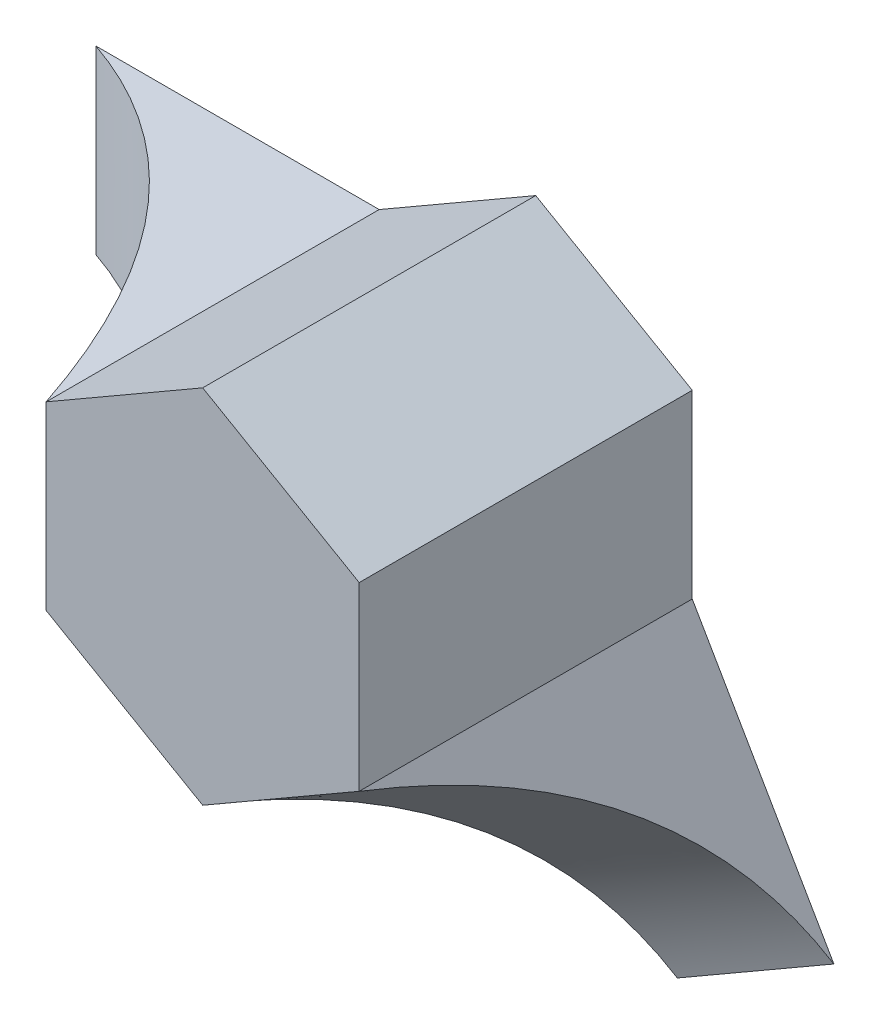
ISO-10303-21;
HEADER;
FILE_DESCRIPTION(('STEP AP214'),'2;1');
FILE_NAME('part.step','',(''),(''),'','','');
FILE_SCHEMA(('AUTOMOTIVE_DESIGN { 1 0 10303 214 1 1 1 1 }'));
ENDSEC;
DATA;
#1=APPLICATION_CONTEXT('core data for automotive mechanical design processes');
#2=APPLICATION_PROTOCOL_DEFINITION('international standard','automotive_design',2000,#1);
#3=PRODUCT_CONTEXT('',#1,'mechanical');
#4=PRODUCT('Part','Part','',(#3));
#5=PRODUCT_RELATED_PRODUCT_CATEGORY('part','',(#4));
#6=PRODUCT_DEFINITION_FORMATION('','',#4);
#7=PRODUCT_DEFINITION_CONTEXT('part definition',#1,'design');
#8=PRODUCT_DEFINITION('design','',#6,#7);
#9=PRODUCT_DEFINITION_SHAPE('','',#8);
#10=(LENGTH_UNIT() NAMED_UNIT(*) SI_UNIT(.MILLI.,.METRE.));
#11=(NAMED_UNIT(*) PLANE_ANGLE_UNIT() SI_UNIT($,.RADIAN.));
#12=(NAMED_UNIT(*) SI_UNIT($,.STERADIAN.) SOLID_ANGLE_UNIT());
#13=UNCERTAINTY_MEASURE_WITH_UNIT(LENGTH_MEASURE(1.E-05),#10,'distance_accuracy_value','');
#14=(GEOMETRIC_REPRESENTATION_CONTEXT(3) GLOBAL_UNCERTAINTY_ASSIGNED_CONTEXT((#13)) GLOBAL_UNIT_ASSIGNED_CONTEXT((#10,
#11,#12)) REPRESENTATION_CONTEXT('',''));
#15=CARTESIAN_POINT('',(0.,0.,0.));
#16=DIRECTION('',(0.,0.,1.));
#17=DIRECTION('',(1.,0.,0.));
#18=AXIS2_PLACEMENT_3D('',#15,#16,#17);
#19=CARTESIAN_POINT('',(44.6490511794399,-25.778141717511,47.5));
#20=DIRECTION('',(-1.,0.,0.));
#21=DIRECTION('',(0.,-1.,0.));
#22=AXIS2_PLACEMENT_3D('',#19,#20,#21);
#23=PLANE('',#22);
#24=DIRECTION('',(0.,1.,0.));
#25=VECTOR('',#24,1.);
#26=CARTESIAN_POINT('',(44.6490511794399,-25.778141717511,-47.5));
#27=LINE('',#26,#25);
#28=CARTESIAN_POINT('',(44.6490511794399,-25.778141717511,-47.5));
#29=VERTEX_POINT('',#28);
#30=CARTESIAN_POINT('',(44.6490511794399,25.778141717511,-47.5));
#31=VERTEX_POINT('',#30);
#32=EDGE_CURVE('E185',#29,#31,#27,.T.);
#33=ORIENTED_EDGE('',*,*,#32,.T.);
#34=DIRECTION('',(0.,0.,-1.));
#35=VECTOR('',#34,1.);
#36=CARTESIAN_POINT('',(44.6490511794399,25.778141717511,47.5));
#37=LINE('',#36,#35);
#38=CARTESIAN_POINT('',(44.6490511794399,25.778141717511,47.5));
#39=VERTEX_POINT('',#38);
#40=EDGE_CURVE('E11',#39,#31,#37,.T.);
#41=ORIENTED_EDGE('',*,*,#40,.F.);
#42=DIRECTION('',(0.,1.,0.));
#43=VECTOR('',#42,1.);
#44=CARTESIAN_POINT('',(44.6490511794399,-25.778141717511,47.5));
#45=LINE('',#44,#43);
#46=CARTESIAN_POINT('',(44.6490511794399,-25.778141717511,47.5));
#47=VERTEX_POINT('',#46);
#48=EDGE_CURVE('E202',#47,#39,#45,.T.);
#49=ORIENTED_EDGE('',*,*,#48,.F.);
#50=DIRECTION('',(0.,0.,-1.));
#51=VECTOR('',#50,1.);
#52=CARTESIAN_POINT('',(44.6490511794399,-25.778141717511,47.5));
#53=LINE('',#52,#51);
#54=EDGE_CURVE('E188',#47,#29,#53,.T.);
#55=ORIENTED_EDGE('',*,*,#54,.T.);
#56=EDGE_LOOP('',(#33,#41,#49,#55));
#57=FACE_BOUND('',#56,.T.);
#58=ADVANCED_FACE('F33',(#57),#23,.F.);
#59=CARTESIAN_POINT('',(44.6490511794399,25.778141717511,47.5));
#60=DIRECTION('',(-0.5,-0.866025403784439,0.));
#61=DIRECTION('',(0.866025403784439,-0.5,0.));
#62=AXIS2_PLACEMENT_3D('',#59,#60,#61);
#63=PLANE('',#62);
#64=DIRECTION('',(-0.866025403784439,0.5,0.));
#65=VECTOR('',#64,1.);
#66=CARTESIAN_POINT('',(44.6490511794399,25.778141717511,-47.5));
#67=LINE('',#66,#65);
#68=CARTESIAN_POINT('',(0.,51.556283435022,-47.5));
#69=VERTEX_POINT('',#68);
#70=EDGE_CURVE('E65',#31,#69,#67,.T.);
#71=ORIENTED_EDGE('',*,*,#70,.T.);
#72=DIRECTION('',(0.,0.,-1.));
#73=VECTOR('',#72,1.);
#74=CARTESIAN_POINT('',(0.,51.556283435022,47.5));
#75=LINE('',#74,#73);
#76=CARTESIAN_POINT('',(0.,51.556283435022,47.5));
#77=VERTEX_POINT('',#76);
#78=EDGE_CURVE('E42',#77,#69,#75,.T.);
#79=ORIENTED_EDGE('',*,*,#78,.F.);
#80=DIRECTION('',(-0.866025403784439,0.5,0.));
#81=VECTOR('',#80,1.);
#82=CARTESIAN_POINT('',(44.6490511794399,25.778141717511,47.5));
#83=LINE('',#82,#81);
#84=EDGE_CURVE('E79',#39,#77,#83,.T.);
#85=ORIENTED_EDGE('',*,*,#84,.F.);
#86=ORIENTED_EDGE('',*,*,#40,.T.);
#87=EDGE_LOOP('',(#71,#79,#85,#86));
#88=FACE_BOUND('',#87,.T.);
#89=ADVANCED_FACE('F173',(#88),#63,.F.);
#90=CARTESIAN_POINT('',(0.,51.556283435022,47.5));
#91=DIRECTION('',(0.5,-0.866025403784439,0.));
#92=DIRECTION('',(0.866025403784439,0.5,0.));
#93=AXIS2_PLACEMENT_3D('',#90,#91,#92);
#94=PLANE('',#93);
#95=DIRECTION('',(-0.866025403784439,-0.5,0.));
#96=VECTOR('',#95,1.);
#97=CARTESIAN_POINT('',(0.,51.556283435022,-47.5));
#98=LINE('',#97,#96);
#99=CARTESIAN_POINT('',(-44.6490511794399,25.778141717511,-47.5));
#100=VERTEX_POINT('',#99);
#101=EDGE_CURVE('E101',#69,#100,#98,.T.);
#102=ORIENTED_EDGE('',*,*,#101,.T.);
#103=DIRECTION('',(0.,0.,-1.));
#104=VECTOR('',#103,1.);
#105=CARTESIAN_POINT('',(-44.6490511794399,25.778141717511,47.5));
#106=LINE('',#105,#104);
#107=CARTESIAN_POINT('',(-44.6490511794399,25.778141717511,47.5));
#108=VERTEX_POINT('',#107);
#109=EDGE_CURVE('E97',#108,#100,#106,.T.);
#110=ORIENTED_EDGE('',*,*,#109,.F.);
#111=DIRECTION('',(-0.866025403784439,-0.5,0.));
#112=VECTOR('',#111,1.);
#113=CARTESIAN_POINT('',(0.,51.556283435022,47.5));
#114=LINE('',#113,#112);
#115=EDGE_CURVE('E87',#77,#108,#114,.T.);
#116=ORIENTED_EDGE('',*,*,#115,.F.);
#117=ORIENTED_EDGE('',*,*,#78,.T.);
#118=EDGE_LOOP('',(#102,#110,#116,#117));
#119=FACE_BOUND('',#118,.T.);
#120=ADVANCED_FACE('F98',(#119),#94,.F.);
#121=CARTESIAN_POINT('',(-44.6490511794399,-25.778141717511,47.5));
#122=DIRECTION('',(0.5,0.866025403784439,0.));
#123=DIRECTION('',(-0.866025403784439,0.5,0.));
#124=AXIS2_PLACEMENT_3D('',#121,#122,#123);
#125=PLANE('',#124);
#126=DIRECTION('',(0.866025403784439,-0.5,0.));
#127=VECTOR('',#126,1.);
#128=CARTESIAN_POINT('',(-44.6490511794399,-25.778141717511,-47.5));
#129=LINE('',#128,#127);
#130=CARTESIAN_POINT('',(-44.6490511794399,-25.778141717511,-47.5));
#131=VERTEX_POINT('',#130);
#132=CARTESIAN_POINT('',(0.,-51.556283435022,-47.5));
#133=VERTEX_POINT('',#132);
#134=EDGE_CURVE('E200',#131,#133,#129,.T.);
#135=ORIENTED_EDGE('',*,*,#134,.T.);
#136=DIRECTION('',(0.,0.,-1.));
#137=VECTOR('',#136,1.);
#138=CARTESIAN_POINT('',(0.,-51.556283435022,47.5));
#139=LINE('',#138,#137);
#140=CARTESIAN_POINT('',(0.,-51.556283435022,47.5));
#141=VERTEX_POINT('',#140);
#142=EDGE_CURVE('E203',#141,#133,#139,.T.);
#143=ORIENTED_EDGE('',*,*,#142,.F.);
#144=DIRECTION('',(0.866025403784439,-0.5,0.));
#145=VECTOR('',#144,1.);
#146=CARTESIAN_POINT('',(-44.6490511794399,-25.778141717511,47.5));
#147=LINE('',#146,#145);
#148=CARTESIAN_POINT('',(-44.6490511794399,-25.778141717511,47.5));
#149=VERTEX_POINT('',#148);
#150=EDGE_CURVE('E117',#149,#141,#147,.T.);
#151=ORIENTED_EDGE('',*,*,#150,.F.);
#152=DIRECTION('',(0.,0.,-1.));
#153=VECTOR('',#152,1.);
#154=CARTESIAN_POINT('',(-44.6490511794399,-25.778141717511,47.5));
#155=LINE('',#154,#153);
#156=EDGE_CURVE('E73',#149,#131,#155,.T.);
#157=ORIENTED_EDGE('',*,*,#156,.T.);
#158=EDGE_LOOP('',(#135,#143,#151,#157));
#159=FACE_BOUND('',#158,.T.);
#160=ADVANCED_FACE('F166',(#159),#125,.F.);
#161=CARTESIAN_POINT('',(0.,0.,47.5));
#162=DIRECTION('',(0.,0.,1.));
#163=DIRECTION('',(1.,0.,0.));
#164=AXIS2_PLACEMENT_3D('',#161,#162,#163);
#165=PLANE('',#164);
#166=ORIENTED_EDGE('',*,*,#48,.T.);
#167=ORIENTED_EDGE('',*,*,#84,.T.);
#168=ORIENTED_EDGE('',*,*,#115,.T.);
#169=DIRECTION('',(0.,-1.,0.));
#170=VECTOR('',#169,1.);
#171=CARTESIAN_POINT('',(-44.6490511794399,25.778141717511,47.5));
#172=LINE('',#171,#170);
#173=EDGE_CURVE('E92',#108,#149,#172,.T.);
#174=ORIENTED_EDGE('',*,*,#173,.T.);
#175=ORIENTED_EDGE('',*,*,#150,.T.);
#176=DIRECTION('',(0.866025403784439,0.5,0.));
#177=VECTOR('',#176,1.);
#178=CARTESIAN_POINT('',(0.,-51.556283435022,47.5));
#179=LINE('',#178,#177);
#180=EDGE_CURVE('E206',#141,#47,#179,.T.);
#181=ORIENTED_EDGE('',*,*,#180,.T.);
#182=EDGE_LOOP('',(#166,#167,#168,#174,#175,#181));
#183=FACE_BOUND('',#182,.T.);
#184=ADVANCED_FACE('F89',(#183),#165,.T.);
#185=CARTESIAN_POINT('',(0.,0.,-47.5));
#186=DIRECTION('',(0.,0.,1.));
#187=DIRECTION('',(1.,0.,0.));
#188=AXIS2_PLACEMENT_3D('',#185,#186,#187);
#189=PLANE('',#188);
#190=ORIENTED_EDGE('',*,*,#32,.F.);
#191=DIRECTION('',(0.5,-0.866025403784439,0.));
#192=VECTOR('',#191,1.);
#193=CARTESIAN_POINT('',(44.6490511794399,-25.778141717511,-47.5));
#194=LINE('',#193,#192);
#195=CARTESIAN_POINT('',(85.0498012231964,-95.7542934571807,-47.5000000070396));
#196=VERTEX_POINT('',#195);
#197=EDGE_CURVE('E136',#29,#196,#194,.T.);
#198=ORIENTED_EDGE('',*,*,#197,.T.);
#199=DIRECTION('',(0.866025403784439,0.5,0.));
#200=VECTOR('',#199,1.);
#201=CARTESIAN_POINT('',(40.4007500437565,-121.532435174692,-47.5000000070396));
#202=LINE('',#201,#200);
#203=CARTESIAN_POINT('',(40.4007500437565,-121.532435174692,-47.5000000070396));
#204=VERTEX_POINT('',#203);
#205=EDGE_CURVE('E190',#204,#196,#202,.T.);
#206=ORIENTED_EDGE('',*,*,#205,.F.);
#207=DIRECTION('',(0.5,-0.866025403784439,0.));
#208=VECTOR('',#207,1.);
#209=CARTESIAN_POINT('',(0.,-51.556283435022,-47.5));
#210=LINE('',#209,#208);
#211=EDGE_CURVE('E140',#133,#204,#210,.T.);
#212=ORIENTED_EDGE('',*,*,#211,.F.);
#213=ORIENTED_EDGE('',*,*,#134,.F.);
#214=DIRECTION('',(-1.,0.,-2.73764255693378E-13));
#215=VECTOR('',#214,1.);
#216=CARTESIAN_POINT('',(1.30106058973964E-11,-25.778141717511,-47.4999999999878));
#217=LINE('',#216,#215);
#218=CARTESIAN_POINT('',(-125.452857029216,-25.778141717511,-47.5000000000221));
#219=VERTEX_POINT('',#218);
#220=EDGE_CURVE('E122',#131,#219,#217,.T.);
#221=ORIENTED_EDGE('',*,*,#220,.T.);
#222=DIRECTION('',(0.,1.,0.));
#223=VECTOR('',#222,1.);
#224=CARTESIAN_POINT('',(-125.452857029216,-25.778141717511,-47.5000000000221));
#225=LINE('',#224,#223);
#226=CARTESIAN_POINT('',(-125.452857029216,25.778141717511,-47.5000000000221));
#227=VERTEX_POINT('',#226);
#228=EDGE_CURVE('E137',#219,#227,#225,.T.);
#229=ORIENTED_EDGE('',*,*,#228,.T.);
#230=DIRECTION('',(-1.,0.,-2.73764255693378E-13));
#231=VECTOR('',#230,1.);
#232=CARTESIAN_POINT('',(1.29967281095886E-11,25.778141717511,-47.4999999999878));
#233=LINE('',#232,#231);
#234=EDGE_CURVE('E127',#100,#227,#233,.T.);
#235=ORIENTED_EDGE('',*,*,#234,.F.);
#236=ORIENTED_EDGE('',*,*,#101,.F.);
#237=ORIENTED_EDGE('',*,*,#70,.F.);
#238=EDGE_LOOP('',(#190,#198,#206,#212,#213,#221,#229,#235,#236,#237));
#239=FACE_BOUND('',#238,.T.);
#240=ADVANCED_FACE('F161',(#239),#189,.F.);
#241=CARTESIAN_POINT('',(240355.390876552,-416359.305154701,876992.940447954));
#242=CARTESIAN_POINT('',(-233913.786445928,405099.006431729,-883825.953881734));
#243=CARTESIAN_POINT('',(227603.476936997,-394272.342317646,890495.170170825));
#244=B_SPLINE_CURVE_WITH_KNOTS('',2,(#241,#242,#243),.UNSPECIFIED.,.F.,.F.,(3,3),(0.,1.),.UNSPECIFIED.);
#245=DIRECTION('',(0.866025403784439,0.5,0.));
#246=VECTOR('',#245,1.);
#247=SURFACE_OF_LINEAR_EXTRUSION('',#244,#246);
#248=CARTESIAN_POINT('',(240400.039927732,-416333.527012983,876992.940447954));
#249=CARTESIAN_POINT('',(-233869.137394748,405124.784573446,-883825.953881734));
#250=CARTESIAN_POINT('',(227648.125988177,-394246.564175928,890495.170170825));
#251=B_SPLINE_CURVE_WITH_KNOTS('',2,(#248,#249,#250),.UNSPECIFIED.,.F.,.F.,(3,3),(0.,1.),.UNSPECIFIED.);
#252=CARTESIAN_POINT('',(44.6490511794399,-25.778141717511,47.5169645237843));
#253=VERTEX_POINT('',#252);
#254=EDGE_CURVE('E238',#196,#253,#251,.T.);
#255=ORIENTED_EDGE('',*,*,#254,.T.);
#256=DIRECTION('',(0.866025403784439,0.5,0.));
#257=VECTOR('',#256,1.);
#258=CARTESIAN_POINT('',(0.,-51.556283435022,47.5169645237843));
#259=LINE('',#258,#257);
#260=CARTESIAN_POINT('',(0.,-51.556283435022,47.5169645237843));
#261=VERTEX_POINT('',#260);
#262=EDGE_CURVE('E194',#261,#253,#259,.T.);
#263=ORIENTED_EDGE('',*,*,#262,.F.);
#264=EDGE_CURVE('E143',#204,#261,#244,.T.);
#265=ORIENTED_EDGE('',*,*,#264,.F.);
#266=ORIENTED_EDGE('',*,*,#205,.T.);
#267=EDGE_LOOP('',(#255,#263,#265,#266));
#268=FACE_BOUND('',#267,.T.);
#269=ADVANCED_FACE('F156',(#268),#247,.F.);
#270=CARTESIAN_POINT('',(0.,-51.556283435022,47.5169645237843));
#271=DIRECTION('',(0.5,-0.866025403784439,0.));
#272=DIRECTION('',(0.866025403784439,0.5,0.));
#273=AXIS2_PLACEMENT_3D('',#270,#271,#272);
#274=PLANE('',#273);
#275=ORIENTED_EDGE('',*,*,#180,.F.);
#276=DIRECTION('',(0.,0.,-1.));
#277=VECTOR('',#276,1.);
#278=CARTESIAN_POINT('',(0.,-51.556283435022,47.5169645237843));
#279=LINE('',#278,#277);
#280=EDGE_CURVE('E149',#261,#141,#279,.T.);
#281=ORIENTED_EDGE('',*,*,#280,.F.);
#282=ORIENTED_EDGE('',*,*,#262,.T.);
#283=DIRECTION('',(0.,0.,-1.));
#284=VECTOR('',#283,1.);
#285=CARTESIAN_POINT('',(44.6490511794399,-25.778141717511,47.5169645237843));
#286=LINE('',#285,#284);
#287=EDGE_CURVE('E51',#253,#47,#286,.T.);
#288=ORIENTED_EDGE('',*,*,#287,.T.);
#289=EDGE_LOOP('',(#275,#281,#282,#288));
#290=FACE_BOUND('',#289,.T.);
#291=ADVANCED_FACE('F160',(#290),#274,.F.);
#292=CARTESIAN_POINT('',(32.8237304234529,-108.408652222396,-40.9492861724345));
#293=DIRECTION('',(-0.866025403784439,-0.5,0.));
#294=DIRECTION('',(0.5,-0.866025403784439,0.));
#295=AXIS2_PLACEMENT_3D('',#292,#293,#294);
#296=PLANE('',#295);
#297=ORIENTED_EDGE('',*,*,#211,.T.);
#298=ORIENTED_EDGE('',*,*,#264,.T.);
#299=ORIENTED_EDGE('',*,*,#280,.T.);
#300=ORIENTED_EDGE('',*,*,#142,.T.);
#301=EDGE_LOOP('',(#297,#298,#299,#300));
#302=FACE_BOUND('',#301,.T.);
#303=ADVANCED_FACE('F223',(#302),#296,.T.);
#304=CARTESIAN_POINT('',(77.4727816028928,-82.6305105048846,-40.9492861724345));
#305=DIRECTION('',(-0.866025403784439,-0.5,0.));
#306=DIRECTION('',(0.5,-0.866025403784439,0.));
#307=AXIS2_PLACEMENT_3D('',#304,#305,#306);
#308=PLANE('',#307);
#309=ORIENTED_EDGE('',*,*,#197,.F.);
#310=ORIENTED_EDGE('',*,*,#54,.F.);
#311=ORIENTED_EDGE('',*,*,#287,.F.);
#312=ORIENTED_EDGE('',*,*,#254,.F.);
#313=EDGE_LOOP('',(#309,#310,#311,#312));
#314=FACE_BOUND('',#313,.T.);
#315=ADVANCED_FACE('F246',(#314),#308,.F.);
#316=CARTESIAN_POINT('',(-25.8315594076436,-25.778141717511,56.1559818028401));
#317=DIRECTION('',(-0.417903041572662,0.,0.908491633337544));
#318=DIRECTION('',(0.908491633337544,0.,0.417903041572662));
#319=AXIS2_PLACEMENT_3D('',#316,#317,#318);
#320=PLANE('',#319);
#321=DIRECTION('',(0.908491633337544,0.,0.417903041572662));
#322=VECTOR('',#321,1.);
#323=CARTESIAN_POINT('',(-25.8315594076436,25.778141717511,56.1559818028401));
#324=LINE('',#323,#322);
#325=CARTESIAN_POINT('',(-44.66905118,25.778141717511,47.4908000682023));
#326=VERTEX_POINT('',#325);
#327=EDGE_CURVE('E113',#326,#108,#324,.T.);
#328=ORIENTED_EDGE('',*,*,#327,.F.);
#329=DIRECTION('',(0.,1.,0.));
#330=VECTOR('',#329,1.);
#331=CARTESIAN_POINT('',(-44.66905118,-25.778141717511,47.4908000682023));
#332=LINE('',#331,#330);
#333=CARTESIAN_POINT('',(-44.66905118,-25.778141717511,47.4908000682023));
#334=VERTEX_POINT('',#333);
#335=EDGE_CURVE('E133',#334,#326,#332,.T.);
#336=ORIENTED_EDGE('',*,*,#335,.F.);
#337=DIRECTION('',(0.908491633337544,0.,0.417903041572662));
#338=VECTOR('',#337,1.);
#339=CARTESIAN_POINT('',(-25.8315594076436,-25.778141717511,56.1559818028401));
#340=LINE('',#339,#338);
#341=EDGE_CURVE('E116',#334,#149,#340,.T.);
#342=ORIENTED_EDGE('',*,*,#341,.T.);
#343=ORIENTED_EDGE('',*,*,#173,.F.);
#344=EDGE_LOOP('',(#328,#336,#342,#343));
#345=FACE_BOUND('',#344,.T.);
#346=ADVANCED_FACE('F110',(#345),#320,.T.);
#347=CARTESIAN_POINT('',(-480829.014898139,-25.7781417176404,876952.605687857));
#348=CARTESIAN_POINT('',(467857.408293464,-25.7781417173851,-883786.514266909));
#349=CARTESIAN_POINT('',(-455326.984972046,-25.7781417176336,890456.635393857));
#350=B_SPLINE_CURVE_WITH_KNOTS('',2,(#347,#348,#349),.UNSPECIFIED.,.F.,.F.,(3,3),(0.,1.),.UNSPECIFIED.);
#351=DIRECTION('',(0.,1.,0.));
#352=VECTOR('',#351,1.);
#353=SURFACE_OF_LINEAR_EXTRUSION('',#350,#352);
#354=CARTESIAN_POINT('',(-480829.014898139,25.7781417173816,876952.605687857));
#355=CARTESIAN_POINT('',(467857.408293464,25.7781417176369,-883786.514266909));
#356=CARTESIAN_POINT('',(-455326.984972046,25.7781417173884,890456.635393857));
#357=B_SPLINE_CURVE_WITH_KNOTS('',2,(#354,#355,#356),.UNSPECIFIED.,.F.,.F.,(3,3),(0.,1.),.UNSPECIFIED.);
#358=EDGE_CURVE('E121',#227,#326,#357,.T.);
#359=ORIENTED_EDGE('',*,*,#358,.F.);
#360=ORIENTED_EDGE('',*,*,#228,.F.);
#361=EDGE_CURVE('E125',#219,#334,#350,.T.);
#362=ORIENTED_EDGE('',*,*,#361,.T.);
#363=ORIENTED_EDGE('',*,*,#335,.T.);
#364=EDGE_LOOP('',(#359,#360,#362,#363));
#365=FACE_BOUND('',#364,.T.);
#366=ADVANCED_FACE('F268',(#365),#353,.T.);
#367=CARTESIAN_POINT('',(0.,-25.778141717511,0.));
#368=DIRECTION('',(0.,1.,0.));
#369=DIRECTION('',(-1.,0.,0.));
#370=AXIS2_PLACEMENT_3D('',#367,#368,#369);
#371=PLANE('',#370);
#372=ORIENTED_EDGE('',*,*,#220,.F.);
#373=ORIENTED_EDGE('',*,*,#156,.F.);
#374=ORIENTED_EDGE('',*,*,#341,.F.);
#375=ORIENTED_EDGE('',*,*,#361,.F.);
#376=EDGE_LOOP('',(#372,#373,#374,#375));
#377=FACE_BOUND('',#376,.T.);
#378=ADVANCED_FACE('F270',(#377),#371,.F.);
#379=CARTESIAN_POINT('',(0.,25.778141717511,0.));
#380=DIRECTION('',(0.,1.,0.));
#381=DIRECTION('',(-1.,0.,0.));
#382=AXIS2_PLACEMENT_3D('',#379,#380,#381);
#383=PLANE('',#382);
#384=ORIENTED_EDGE('',*,*,#234,.T.);
#385=ORIENTED_EDGE('',*,*,#358,.T.);
#386=ORIENTED_EDGE('',*,*,#327,.T.);
#387=ORIENTED_EDGE('',*,*,#109,.T.);
#388=EDGE_LOOP('',(#384,#385,#386,#387));
#389=FACE_BOUND('',#388,.T.);
#390=ADVANCED_FACE('F119',(#389),#383,.T.);
#391=CLOSED_SHELL('',(#58,#89,#120,#160,#184,#240,#269,#291,#303,#315,#346,#366,#378,#390));
#392=MANIFOLD_SOLID_BREP('B2',#391);
#393=ADVANCED_BREP_SHAPE_REPRESENTATION('',(#18,#392),#14);
#394=SHAPE_DEFINITION_REPRESENTATION(#9,#393);
ENDSEC;
END-ISO-10303-21;
